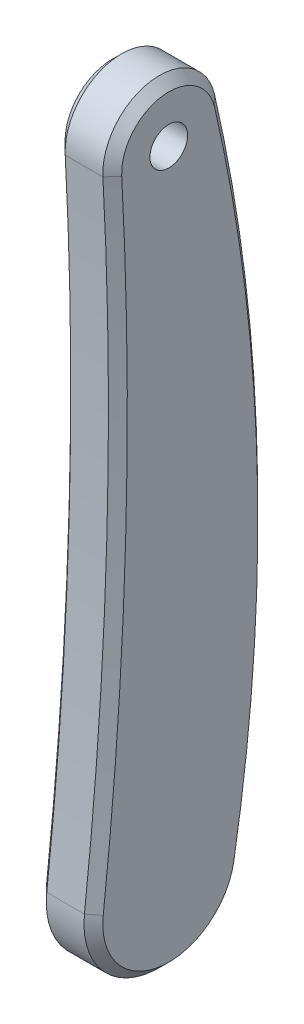
ISO-10303-21;
HEADER;
FILE_DESCRIPTION(('STEP AP214'),'2;1');
FILE_NAME('part.step','',(''),(''),'','','');
FILE_SCHEMA(('AUTOMOTIVE_DESIGN { 1 0 10303 214 1 1 1 1 }'));
ENDSEC;
DATA;
#1=APPLICATION_CONTEXT('core data for automotive mechanical design processes');
#2=APPLICATION_PROTOCOL_DEFINITION('international standard','automotive_design',2000,#1);
#3=PRODUCT_CONTEXT('',#1,'mechanical');
#4=PRODUCT('Part','Part','',(#3));
#5=PRODUCT_RELATED_PRODUCT_CATEGORY('part','',(#4));
#6=PRODUCT_DEFINITION_FORMATION('','',#4);
#7=PRODUCT_DEFINITION_CONTEXT('part definition',#1,'design');
#8=PRODUCT_DEFINITION('design','',#6,#7);
#9=PRODUCT_DEFINITION_SHAPE('','',#8);
#10=(LENGTH_UNIT() NAMED_UNIT(*) SI_UNIT(.MILLI.,.METRE.));
#11=(NAMED_UNIT(*) PLANE_ANGLE_UNIT() SI_UNIT($,.RADIAN.));
#12=(NAMED_UNIT(*) SI_UNIT($,.STERADIAN.) SOLID_ANGLE_UNIT());
#13=UNCERTAINTY_MEASURE_WITH_UNIT(LENGTH_MEASURE(1.E-05),#10,'distance_accuracy_value','');
#14=(GEOMETRIC_REPRESENTATION_CONTEXT(3) GLOBAL_UNCERTAINTY_ASSIGNED_CONTEXT((#13)) GLOBAL_UNIT_ASSIGNED_CONTEXT((#10,
#11,#12)) REPRESENTATION_CONTEXT('',''));
#15=CARTESIAN_POINT('',(0.,0.,0.));
#16=DIRECTION('',(0.,0.,1.));
#17=DIRECTION('',(1.,0.,0.));
#18=AXIS2_PLACEMENT_3D('',#15,#16,#17);
#19=CARTESIAN_POINT('',(7.5,29.9264705882359,1013.50476385567));
#20=DIRECTION('',(-1.,0.,0.));
#21=DIRECTION('',(0.,0.,1.));
#22=AXIS2_PLACEMENT_3D('',#19,#20,#21);
#23=CYLINDRICAL_SURFACE('',#22,1000.);
#24=DIRECTION('',(-1.,0.,0.));
#25=VECTOR('',#24,1.);
#26=CARTESIAN_POINT('',(7.5,84.1861054766735,14.9779029141232));
#27=LINE('',#26,#25);
#28=CARTESIAN_POINT('',(5.,84.1861054766735,14.9779029141232));
#29=VERTEX_POINT('',#28);
#30=CARTESIAN_POINT('',(-5.00000000000011,84.1861054766735,14.9779029141232));
#31=VERTEX_POINT('',#30);
#32=EDGE_CURVE('E116',#29,#31,#27,.T.);
#33=ORIENTED_EDGE('',*,*,#32,.T.);
#34=CARTESIAN_POINT('',(-5.00000000000011,29.9264705882359,1013.50476385567));
#35=DIRECTION('',(1.,0.,0.));
#36=DIRECTION('',(0.,0.,-1.));
#37=AXIS2_PLACEMENT_3D('',#34,#35,#36);
#38=CIRCLE('',#37,1000.);
#39=CARTESIAN_POINT('',(-5.00000000000011,-82.7465397923875,19.8726424285425));
#40=VERTEX_POINT('',#39);
#41=EDGE_CURVE('E200',#31,#40,#38,.F.);
#42=ORIENTED_EDGE('',*,*,#41,.T.);
#43=DIRECTION('',(-1.,0.,0.));
#44=VECTOR('',#43,1.);
#45=CARTESIAN_POINT('',(7.5,-82.7465397923875,19.8726424285425));
#46=LINE('',#45,#44);
#47=CARTESIAN_POINT('',(5.,-82.7465397923875,19.8726424285425));
#48=VERTEX_POINT('',#47);
#49=EDGE_CURVE('E137',#48,#40,#46,.T.);
#50=ORIENTED_EDGE('',*,*,#49,.F.);
#51=CARTESIAN_POINT('',(5.,29.9264705882359,1013.50476385567));
#52=DIRECTION('',(1.,0.,0.));
#53=DIRECTION('',(0.,0.,-1.));
#54=AXIS2_PLACEMENT_3D('',#51,#52,#53);
#55=CIRCLE('',#54,1000.);
#56=EDGE_CURVE('E198',#48,#29,#55,.T.);
#57=ORIENTED_EDGE('',*,*,#56,.T.);
#58=EDGE_LOOP('',(#33,#42,#50,#57));
#59=FACE_BOUND('',#58,.T.);
#60=ADVANCED_FACE('F41',(#59),#23,.F.);
#61=CARTESIAN_POINT('',(7.5,-85.,0.));
#62=DIRECTION('',(-1.,0.,0.));
#63=DIRECTION('',(0.,0.,1.));
#64=AXIS2_PLACEMENT_3D('',#61,#62,#63);
#65=CYLINDRICAL_SURFACE('',#64,20.0000000000001);
#66=ORIENTED_EDGE('',*,*,#49,.T.);
#67=CARTESIAN_POINT('',(-5.00000000000011,-85.,0.));
#68=DIRECTION('',(1.,0.,0.));
#69=DIRECTION('',(0.,0.,-1.));
#70=AXIS2_PLACEMENT_3D('',#67,#68,#69);
#71=CIRCLE('',#70,20.0000000000001);
#72=CARTESIAN_POINT('',(-5.00000000000011,-88.3618331053352,-19.7154274153992));
#73=VERTEX_POINT('',#72);
#74=EDGE_CURVE('E196',#40,#73,#71,.T.);
#75=ORIENTED_EDGE('',*,*,#74,.T.);
#76=DIRECTION('',(-1.,0.,0.));
#77=VECTOR('',#76,1.);
#78=CARTESIAN_POINT('',(7.5,-88.3618331053352,-19.7154274153992));
#79=LINE('',#78,#77);
#80=CARTESIAN_POINT('',(5.,-88.3618331053352,-19.7154274153992));
#81=VERTEX_POINT('',#80);
#82=EDGE_CURVE('E132',#81,#73,#79,.T.);
#83=ORIENTED_EDGE('',*,*,#82,.F.);
#84=CARTESIAN_POINT('',(5.,-85.,0.));
#85=DIRECTION('',(1.,0.,0.));
#86=DIRECTION('',(0.,0.,-1.));
#87=AXIS2_PLACEMENT_3D('',#84,#85,#86);
#88=CIRCLE('',#87,20.0000000000001);
#89=EDGE_CURVE('E194',#81,#48,#88,.F.);
#90=ORIENTED_EDGE('',*,*,#89,.T.);
#91=EDGE_LOOP('',(#66,#75,#83,#90));
#92=FACE_BOUND('',#91,.T.);
#93=ADVANCED_FACE('F223',(#92),#65,.T.);
#94=CARTESIAN_POINT('',(7.5,-12.7205882352943,423.881689431082));
#95=DIRECTION('',(-1.,0.,0.));
#96=DIRECTION('',(0.,0.,1.));
#97=AXIS2_PLACEMENT_3D('',#94,#95,#96);
#98=CYLINDRICAL_SURFACE('',#97,450.);
#99=ORIENTED_EDGE('',*,*,#82,.T.);
#100=CARTESIAN_POINT('',(-5.00000000000011,-12.7205882352943,423.881689431082));
#101=DIRECTION('',(1.,0.,0.));
#102=DIRECTION('',(0.,0.,-1.));
#103=AXIS2_PLACEMENT_3D('',#100,#101,#102);
#104=CIRCLE('',#103,450.);
#105=CARTESIAN_POINT('',(-5.00000000000011,88.3696754563894,-14.6166099803823));
#106=VERTEX_POINT('',#105);
#107=EDGE_CURVE('E131',#73,#106,#104,.T.);
#108=ORIENTED_EDGE('',*,*,#107,.T.);
#109=DIRECTION('',(-1.,0.,0.));
#110=VECTOR('',#109,1.);
#111=CARTESIAN_POINT('',(7.5,88.3696754563894,-14.6166099803823));
#112=LINE('',#111,#110);
#113=CARTESIAN_POINT('',(5.,88.3696754563894,-14.6166099803823));
#114=VERTEX_POINT('',#113);
#115=EDGE_CURVE('E114',#114,#106,#112,.T.);
#116=ORIENTED_EDGE('',*,*,#115,.F.);
#117=CARTESIAN_POINT('',(5.,-12.7205882352943,423.881689431082));
#118=DIRECTION('',(1.,0.,0.));
#119=DIRECTION('',(0.,0.,-1.));
#120=AXIS2_PLACEMENT_3D('',#117,#118,#119);
#121=CIRCLE('',#120,450.);
#122=EDGE_CURVE('E128',#114,#81,#121,.F.);
#123=ORIENTED_EDGE('',*,*,#122,.T.);
#124=EDGE_LOOP('',(#99,#108,#116,#123));
#125=FACE_BOUND('',#124,.T.);
#126=ADVANCED_FACE('F127',(#125),#98,.T.);
#127=CARTESIAN_POINT('',(7.5,85.,0.));
#128=DIRECTION('',(-1.,0.,0.));
#129=DIRECTION('',(0.,0.,1.));
#130=AXIS2_PLACEMENT_3D('',#127,#128,#129);
#131=CYLINDRICAL_SURFACE('',#130,15.);
#132=ORIENTED_EDGE('',*,*,#115,.T.);
#133=CARTESIAN_POINT('',(-5.00000000000011,85.,0.));
#134=DIRECTION('',(1.,0.,0.));
#135=DIRECTION('',(0.,0.,-1.));
#136=AXIS2_PLACEMENT_3D('',#133,#134,#135);
#137=CIRCLE('',#136,15.);
#138=EDGE_CURVE('E120',#106,#31,#137,.T.);
#139=ORIENTED_EDGE('',*,*,#138,.T.);
#140=ORIENTED_EDGE('',*,*,#32,.F.);
#141=CARTESIAN_POINT('',(5.,85.,0.));
#142=DIRECTION('',(1.,0.,0.));
#143=DIRECTION('',(0.,0.,-1.));
#144=AXIS2_PLACEMENT_3D('',#141,#142,#143);
#145=CIRCLE('',#144,15.);
#146=EDGE_CURVE('E111',#29,#114,#145,.F.);
#147=ORIENTED_EDGE('',*,*,#146,.T.);
#148=EDGE_LOOP('',(#132,#139,#140,#147));
#149=FACE_BOUND('',#148,.T.);
#150=ADVANCED_FACE('F113',(#149),#131,.T.);
#151=CARTESIAN_POINT('',(7.5,57.463235294118,506.752381927834));
#152=DIRECTION('',(1.,0.,0.));
#153=DIRECTION('',(0.,0.,-1.));
#154=AXIS2_PLACEMENT_3D('',#151,#152,#153);
#155=PLANE('',#154);
#156=CARTESIAN_POINT('',(7.5,85.,0.));
#157=DIRECTION('',(1.,0.,0.));
#158=DIRECTION('',(0.,0.,-1.));
#159=AXIS2_PLACEMENT_3D('',#156,#157,#158);
#160=CIRCLE('',#159,5.);
#161=CARTESIAN_POINT('',(7.5,85.,-5.));
#162=VERTEX_POINT('',#161);
#163=EDGE_CURVE('E392',#162,#162,#160,.T.);
#164=ORIENTED_EDGE('',*,*,#163,.F.);
#165=EDGE_LOOP('',(#164));
#166=FACE_BOUND('',#165,.T.);
#167=CARTESIAN_POINT('',(7.5,-85.,0.));
#168=DIRECTION('',(1.,0.,0.));
#169=DIRECTION('',(0.,0.,-1.));
#170=AXIS2_PLACEMENT_3D('',#167,#168,#169);
#171=CIRCLE('',#170,17.5000000000001);
#172=CARTESIAN_POINT('',(7.5,-83.0282223183391,17.3885621249747));
#173=VERTEX_POINT('',#172);
#174=CARTESIAN_POINT('',(7.5,-87.9416039671683,-17.2509989884743));
#175=VERTEX_POINT('',#174);
#176=EDGE_CURVE('E65',#173,#175,#171,.T.);
#177=ORIENTED_EDGE('',*,*,#176,.T.);
#178=CARTESIAN_POINT('',(7.5,-12.7205882352943,423.881689431082));
#179=DIRECTION('',(1.,0.,0.));
#180=DIRECTION('',(0.,0.,-1.));
#181=AXIS2_PLACEMENT_3D('',#178,#179,#180);
#182=CIRCLE('',#181,447.5);
#183=CARTESIAN_POINT('',(7.5,87.8080628803244,-12.1805083169852));
#184=VERTEX_POINT('',#183);
#185=EDGE_CURVE('E50',#175,#184,#182,.T.);
#186=ORIENTED_EDGE('',*,*,#185,.T.);
#187=CARTESIAN_POINT('',(7.5,85.,0.));
#188=DIRECTION('',(1.,0.,0.));
#189=DIRECTION('',(0.,0.,-1.));
#190=AXIS2_PLACEMENT_3D('',#187,#188,#189);
#191=CIRCLE('',#190,12.5);
#192=CARTESIAN_POINT('',(7.5,84.3217545638946,12.4815857617693));
#193=VERTEX_POINT('',#192);
#194=EDGE_CURVE('E140',#184,#193,#191,.T.);
#195=ORIENTED_EDGE('',*,*,#194,.T.);
#196=CARTESIAN_POINT('',(7.5,29.9264705882359,1013.50476385567));
#197=DIRECTION('',(1.,0.,0.));
#198=DIRECTION('',(0.,0.,-1.));
#199=AXIS2_PLACEMENT_3D('',#196,#197,#198);
#200=CIRCLE('',#199,1002.5);
#201=EDGE_CURVE('E202',#193,#173,#200,.F.);
#202=ORIENTED_EDGE('',*,*,#201,.T.);
#203=EDGE_LOOP('',(#177,#186,#195,#202));
#204=FACE_BOUND('',#203,.T.);
#205=ADVANCED_FACE('F205',(#166,#204),#155,.T.);
#206=CARTESIAN_POINT('',(-7.5,57.463235294118,506.752381927834));
#207=DIRECTION('',(1.,0.,0.));
#208=DIRECTION('',(0.,0.,-1.));
#209=AXIS2_PLACEMENT_3D('',#206,#207,#208);
#210=PLANE('',#209);
#211=CARTESIAN_POINT('',(-7.5,-85.,0.));
#212=DIRECTION('',(1.,0.,0.));
#213=DIRECTION('',(0.,0.,-1.));
#214=AXIS2_PLACEMENT_3D('',#211,#212,#213);
#215=CIRCLE('',#214,5.);
#216=CARTESIAN_POINT('',(-7.5,-85.,-5.));
#217=VERTEX_POINT('',#216);
#218=EDGE_CURVE('E11',#217,#217,#215,.F.);
#219=ORIENTED_EDGE('',*,*,#218,.F.);
#220=EDGE_LOOP('',(#219));
#221=FACE_BOUND('',#220,.T.);
#222=CARTESIAN_POINT('',(-7.5,85.,0.));
#223=DIRECTION('',(1.,0.,0.));
#224=DIRECTION('',(0.,0.,-1.));
#225=AXIS2_PLACEMENT_3D('',#222,#223,#224);
#226=CIRCLE('',#225,12.5);
#227=CARTESIAN_POINT('',(-7.5,84.3217545638946,12.4815857617693));
#228=VERTEX_POINT('',#227);
#229=CARTESIAN_POINT('',(-7.5,87.8080628803244,-12.1805083169851));
#230=VERTEX_POINT('',#229);
#231=EDGE_CURVE('E189',#228,#230,#226,.F.);
#232=ORIENTED_EDGE('',*,*,#231,.T.);
#233=CARTESIAN_POINT('',(-7.5,-12.7205882352943,423.881689431082));
#234=DIRECTION('',(1.,0.,0.));
#235=DIRECTION('',(0.,0.,-1.));
#236=AXIS2_PLACEMENT_3D('',#233,#234,#235);
#237=CIRCLE('',#236,447.5);
#238=CARTESIAN_POINT('',(-7.5,-87.9416039671683,-17.2509989884743));
#239=VERTEX_POINT('',#238);
#240=EDGE_CURVE('E121',#230,#239,#237,.F.);
#241=ORIENTED_EDGE('',*,*,#240,.T.);
#242=CARTESIAN_POINT('',(-7.5,-85.,0.));
#243=DIRECTION('',(1.,0.,0.));
#244=DIRECTION('',(0.,0.,-1.));
#245=AXIS2_PLACEMENT_3D('',#242,#243,#244);
#246=CIRCLE('',#245,17.5);
#247=CARTESIAN_POINT('',(-7.5,-83.0282223183391,17.3885621249747));
#248=VERTEX_POINT('',#247);
#249=EDGE_CURVE('E187',#239,#248,#246,.F.);
#250=ORIENTED_EDGE('',*,*,#249,.T.);
#251=CARTESIAN_POINT('',(-7.5,29.9264705882359,1013.50476385567));
#252=DIRECTION('',(1.,0.,0.));
#253=DIRECTION('',(0.,0.,-1.));
#254=AXIS2_PLACEMENT_3D('',#251,#252,#253);
#255=CIRCLE('',#254,1002.5);
#256=EDGE_CURVE('E185',#248,#228,#255,.T.);
#257=ORIENTED_EDGE('',*,*,#256,.T.);
#258=EDGE_LOOP('',(#232,#241,#250,#257));
#259=FACE_BOUND('',#258,.T.);
#260=ADVANCED_FACE('F207',(#221,#259),#210,.F.);
#261=CARTESIAN_POINT('',(-5.00000000000011,29.9264705882359,1013.50476385567));
#262=DIRECTION('',(-1.,0.,0.));
#263=DIRECTION('',(0.,0.,1.));
#264=AXIS2_PLACEMENT_3D('',#261,#262,#263);
#265=CONICAL_SURFACE('',#264,1000.,0.785398163397459);
#266=DIRECTION('',(0.707106781186526,-0.0383673557743206,0.706065114568704));
#267=VECTOR('',#266,1.);
#268=CARTESIAN_POINT('',(-7.5,84.3217545638946,12.4815857617693));
#269=LINE('',#268,#267);
#270=EDGE_CURVE('E163',#228,#31,#269,.T.);
#271=ORIENTED_EDGE('',*,*,#270,.F.);
#272=ORIENTED_EDGE('',*,*,#256,.F.);
#273=DIRECTION('',(-0.707106781186526,-0.0796718496968441,-0.702604011065916));
#274=VECTOR('',#273,1.);
#275=CARTESIAN_POINT('',(-5.00000000000011,-82.7465397923875,19.8726424285425));
#276=LINE('',#275,#274);
#277=EDGE_CURVE('E149',#40,#248,#276,.T.);
#278=ORIENTED_EDGE('',*,*,#277,.F.);
#279=ORIENTED_EDGE('',*,*,#41,.F.);
#280=EDGE_LOOP('',(#271,#272,#278,#279));
#281=FACE_BOUND('',#280,.T.);
#282=ADVANCED_FACE('F215',(#281),#265,.F.);
#283=CARTESIAN_POINT('',(-5.00000000000011,-85.,0.));
#284=DIRECTION('',(1.,0.,0.));
#285=DIRECTION('',(0.,0.,-1.));
#286=AXIS2_PLACEMENT_3D('',#283,#284,#285);
#287=CONICAL_SURFACE('',#286,20.0000000000001,0.785398163397479);
#288=ORIENTED_EDGE('',*,*,#277,.T.);
#289=ORIENTED_EDGE('',*,*,#249,.F.);
#290=DIRECTION('',(-0.707106781186526,0.1188587493,0.697045620971017));
#291=VECTOR('',#290,1.);
#292=CARTESIAN_POINT('',(-5.00000000000011,-88.3618331053352,-19.7154274153992));
#293=LINE('',#292,#291);
#294=EDGE_CURVE('E157',#73,#239,#293,.T.);
#295=ORIENTED_EDGE('',*,*,#294,.F.);
#296=ORIENTED_EDGE('',*,*,#74,.F.);
#297=EDGE_LOOP('',(#288,#289,#295,#296));
#298=FACE_BOUND('',#297,.T.);
#299=ADVANCED_FACE('F245',(#298),#287,.T.);
#300=CARTESIAN_POINT('',(-5.00000000000011,85.,0.));
#301=DIRECTION('',(1.,0.,0.));
#302=DIRECTION('',(0.,0.,-1.));
#303=AXIS2_PLACEMENT_3D('',#300,#301,#302);
#304=CONICAL_SURFACE('',#303,15.,0.785398163397479);
#305=ORIENTED_EDGE('',*,*,#270,.T.);
#306=ORIENTED_EDGE('',*,*,#138,.F.);
#307=DIRECTION('',(0.707106781186526,0.158848024374063,-0.689033602339166));
#308=VECTOR('',#307,1.);
#309=CARTESIAN_POINT('',(-7.5,87.8080628803244,-12.1805083169851));
#310=LINE('',#309,#308);
#311=EDGE_CURVE('E154',#230,#106,#310,.T.);
#312=ORIENTED_EDGE('',*,*,#311,.F.);
#313=ORIENTED_EDGE('',*,*,#231,.F.);
#314=EDGE_LOOP('',(#305,#306,#312,#313));
#315=FACE_BOUND('',#314,.T.);
#316=ADVANCED_FACE('F239',(#315),#304,.T.);
#317=CARTESIAN_POINT('',(-5.00000000000011,-12.7205882352943,423.881689431082));
#318=DIRECTION('',(1.,0.,0.));
#319=DIRECTION('',(0.,0.,-1.));
#320=AXIS2_PLACEMENT_3D('',#317,#318,#319);
#321=CONICAL_SURFACE('',#320,450.,0.785398163397482);
#322=ORIENTED_EDGE('',*,*,#294,.T.);
#323=ORIENTED_EDGE('',*,*,#240,.F.);
#324=ORIENTED_EDGE('',*,*,#311,.T.);
#325=ORIENTED_EDGE('',*,*,#107,.F.);
#326=EDGE_LOOP('',(#322,#323,#324,#325));
#327=FACE_BOUND('',#326,.T.);
#328=ADVANCED_FACE('F233',(#327),#321,.T.);
#329=CARTESIAN_POINT('',(7.5,29.9264705882359,1013.50476385567));
#330=DIRECTION('',(1.,0.,0.));
#331=DIRECTION('',(0.,0.,-1.));
#332=AXIS2_PLACEMENT_3D('',#329,#330,#331);
#333=CONICAL_SURFACE('',#332,1002.5,0.785398163397437);
#334=DIRECTION('',(0.707106781186549,0.0383673557743202,-0.706065114568681));
#335=VECTOR('',#334,1.);
#336=CARTESIAN_POINT('',(5.,84.1861054766735,14.9779029141232));
#337=LINE('',#336,#335);
#338=EDGE_CURVE('E143',#29,#193,#337,.T.);
#339=ORIENTED_EDGE('',*,*,#338,.F.);
#340=ORIENTED_EDGE('',*,*,#56,.F.);
#341=DIRECTION('',(-0.70710678118655,0.0796718496968393,0.702604011065893));
#342=VECTOR('',#341,1.);
#343=CARTESIAN_POINT('',(7.5,-83.0282223183391,17.3885621249747));
#344=LINE('',#343,#342);
#345=EDGE_CURVE('E152',#173,#48,#344,.T.);
#346=ORIENTED_EDGE('',*,*,#345,.F.);
#347=ORIENTED_EDGE('',*,*,#201,.F.);
#348=EDGE_LOOP('',(#339,#340,#346,#347));
#349=FACE_BOUND('',#348,.T.);
#350=ADVANCED_FACE('F44',(#349),#333,.F.);
#351=CARTESIAN_POINT('',(7.5,-85.,0.));
#352=DIRECTION('',(-1.,0.,0.));
#353=DIRECTION('',(0.,0.,1.));
#354=AXIS2_PLACEMENT_3D('',#351,#352,#353);
#355=CONICAL_SURFACE('',#354,17.5000000000001,0.785398163397446);
#356=ORIENTED_EDGE('',*,*,#345,.T.);
#357=ORIENTED_EDGE('',*,*,#89,.F.);
#358=DIRECTION('',(-0.70710678118655,-0.118858749299995,-0.697045620970993));
#359=VECTOR('',#358,1.);
#360=CARTESIAN_POINT('',(7.5,-87.9416039671683,-17.2509989884743));
#361=LINE('',#360,#359);
#362=EDGE_CURVE('E135',#175,#81,#361,.T.);
#363=ORIENTED_EDGE('',*,*,#362,.F.);
#364=ORIENTED_EDGE('',*,*,#176,.F.);
#365=EDGE_LOOP('',(#356,#357,#363,#364));
#366=FACE_BOUND('',#365,.T.);
#367=ADVANCED_FACE('F267',(#366),#355,.T.);
#368=CARTESIAN_POINT('',(7.5,85.,0.));
#369=DIRECTION('',(-1.,0.,0.));
#370=DIRECTION('',(0.,0.,1.));
#371=AXIS2_PLACEMENT_3D('',#368,#369,#370);
#372=CONICAL_SURFACE('',#371,12.5,0.785398163397446);
#373=ORIENTED_EDGE('',*,*,#338,.T.);
#374=ORIENTED_EDGE('',*,*,#194,.F.);
#375=DIRECTION('',(0.707106781186549,-0.158848024374057,0.689033602339143));
#376=VECTOR('',#375,1.);
#377=CARTESIAN_POINT('',(5.,88.3696754563893,-14.6166099803822));
#378=LINE('',#377,#376);
#379=EDGE_CURVE('E57',#114,#184,#378,.T.);
#380=ORIENTED_EDGE('',*,*,#379,.F.);
#381=ORIENTED_EDGE('',*,*,#146,.F.);
#382=EDGE_LOOP('',(#373,#374,#380,#381));
#383=FACE_BOUND('',#382,.T.);
#384=ADVANCED_FACE('F139',(#383),#372,.T.);
#385=CARTESIAN_POINT('',(7.5,-12.7205882352943,423.881689431082));
#386=DIRECTION('',(-1.,0.,0.));
#387=DIRECTION('',(0.,0.,1.));
#388=AXIS2_PLACEMENT_3D('',#385,#386,#387);
#389=CONICAL_SURFACE('',#388,447.5,0.785398163397448);
#390=ORIENTED_EDGE('',*,*,#362,.T.);
#391=ORIENTED_EDGE('',*,*,#122,.F.);
#392=ORIENTED_EDGE('',*,*,#379,.T.);
#393=ORIENTED_EDGE('',*,*,#185,.F.);
#394=EDGE_LOOP('',(#390,#391,#392,#393));
#395=FACE_BOUND('',#394,.T.);
#396=ADVANCED_FACE('F134',(#395),#389,.T.);
#397=CARTESIAN_POINT('',(-17.5,-85.,0.));
#398=DIRECTION('',(1.,0.,0.));
#399=DIRECTION('',(0.,0.,-1.));
#400=AXIS2_PLACEMENT_3D('',#397,#398,#399);
#401=CYLINDRICAL_SURFACE('',#400,5.);
#402=CARTESIAN_POINT('',(-17.5,-85.,0.));
#403=DIRECTION('',(-1.,0.,0.));
#404=DIRECTION('',(0.,0.,1.));
#405=AXIS2_PLACEMENT_3D('',#402,#403,#404);
#406=CIRCLE('',#405,5.);
#407=CARTESIAN_POINT('',(-17.5,-85.,5.));
#408=VERTEX_POINT('',#407);
#409=EDGE_CURVE('E141',#408,#408,#406,.T.);
#410=ORIENTED_EDGE('',*,*,#409,.F.);
#411=EDGE_LOOP('',(#410));
#412=FACE_BOUND('',#411,.T.);
#413=ORIENTED_EDGE('',*,*,#218,.T.);
#414=EDGE_LOOP('',(#413));
#415=FACE_BOUND('',#414,.T.);
#416=ADVANCED_FACE('F262',(#412,#415),#401,.T.);
#417=CARTESIAN_POINT('',(-17.5,-85.,0.));
#418=DIRECTION('',(-1.,0.,0.));
#419=DIRECTION('',(0.,0.,1.));
#420=AXIS2_PLACEMENT_3D('',#417,#418,#419);
#421=PLANE('',#420);
#422=ORIENTED_EDGE('',*,*,#409,.T.);
#423=EDGE_LOOP('',(#422));
#424=FACE_BOUND('',#423,.T.);
#425=ADVANCED_FACE('F361',(#424),#421,.T.);
#426=CARTESIAN_POINT('',(-2.5,85.,0.));
#427=DIRECTION('',(1.,0.,0.));
#428=DIRECTION('',(0.,0.,-1.));
#429=AXIS2_PLACEMENT_3D('',#426,#427,#428);
#430=CYLINDRICAL_SURFACE('',#429,5.);
#431=CARTESIAN_POINT('',(-2.5,85.,0.));
#432=DIRECTION('',(1.,0.,0.));
#433=DIRECTION('',(0.,0.,-1.));
#434=AXIS2_PLACEMENT_3D('',#431,#432,#433);
#435=CIRCLE('',#434,5.);
#436=CARTESIAN_POINT('',(-2.5,85.,-5.));
#437=VERTEX_POINT('',#436);
#438=EDGE_CURVE('E146',#437,#437,#435,.T.);
#439=ORIENTED_EDGE('',*,*,#438,.F.);
#440=EDGE_LOOP('',(#439));
#441=FACE_BOUND('',#440,.T.);
#442=ORIENTED_EDGE('',*,*,#163,.T.);
#443=EDGE_LOOP('',(#442));
#444=FACE_BOUND('',#443,.T.);
#445=ADVANCED_FACE('F368',(#441,#444),#430,.F.);
#446=CARTESIAN_POINT('',(-2.5,85.,0.));
#447=DIRECTION('',(1.,0.,0.));
#448=DIRECTION('',(0.,0.,-1.));
#449=AXIS2_PLACEMENT_3D('',#446,#447,#448);
#450=PLANE('',#449);
#451=ORIENTED_EDGE('',*,*,#438,.T.);
#452=EDGE_LOOP('',(#451));
#453=FACE_BOUND('',#452,.T.);
#454=ADVANCED_FACE('F376',(#453),#450,.T.);
#455=CLOSED_SHELL('',(#60,#93,#126,#150,#205,#260,#282,#299,#316,#328,#350,#367,#384,#396,#416,
#425,#445,#454));
#456=MANIFOLD_SOLID_BREP('B2',#455);
#457=ADVANCED_BREP_SHAPE_REPRESENTATION('',(#18,#456),#14);
#458=SHAPE_DEFINITION_REPRESENTATION(#9,#457);
ENDSEC;
END-ISO-10303-21;
